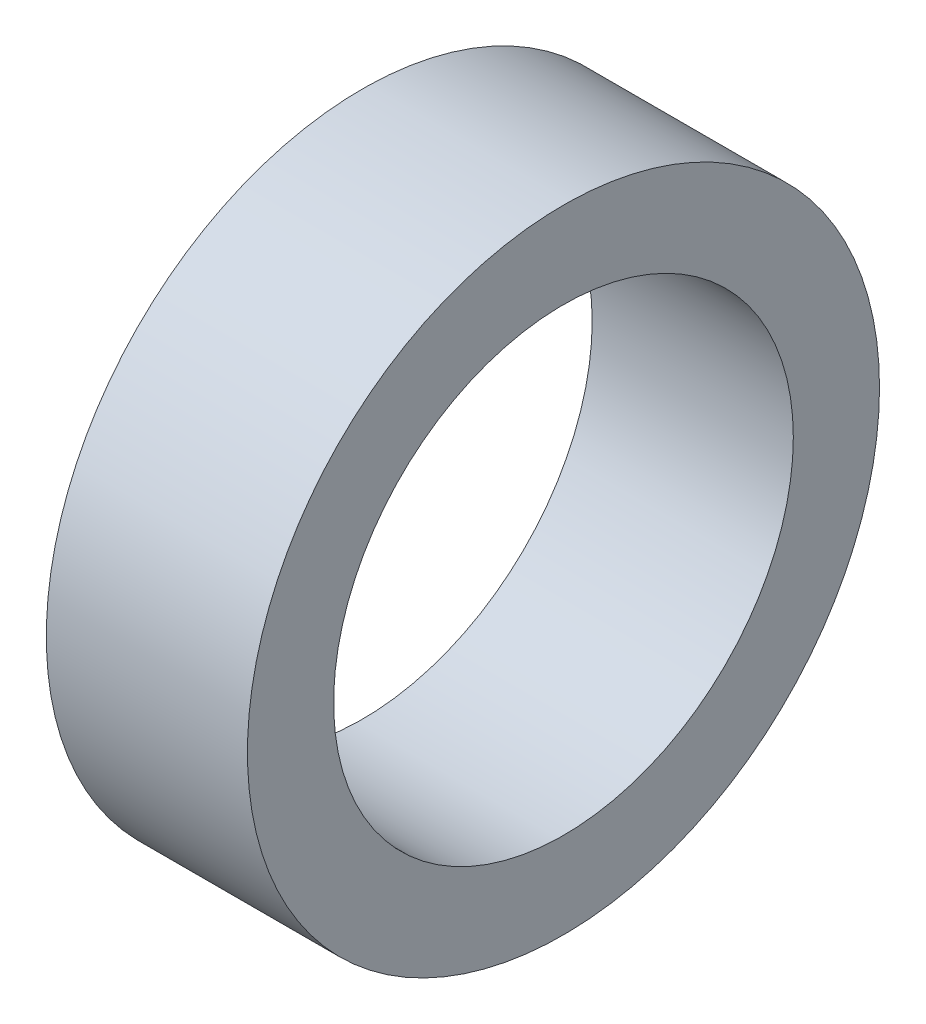
ISO-10303-21;
HEADER;
FILE_DESCRIPTION(('STEP AP214'),'2;1');
FILE_NAME('part.step','',(''),(''),'','','');
FILE_SCHEMA(('AUTOMOTIVE_DESIGN { 1 0 10303 214 1 1 1 1 }'));
ENDSEC;
DATA;
#1=APPLICATION_CONTEXT('core data for automotive mechanical design processes');
#2=APPLICATION_PROTOCOL_DEFINITION('international standard','automotive_design',2000,#1);
#3=PRODUCT_CONTEXT('',#1,'mechanical');
#4=PRODUCT('Part','Part','',(#3));
#5=PRODUCT_RELATED_PRODUCT_CATEGORY('part','',(#4));
#6=PRODUCT_DEFINITION_FORMATION('','',#4);
#7=PRODUCT_DEFINITION_CONTEXT('part definition',#1,'design');
#8=PRODUCT_DEFINITION('design','',#6,#7);
#9=PRODUCT_DEFINITION_SHAPE('','',#8);
#10=(LENGTH_UNIT() NAMED_UNIT(*) SI_UNIT(.MILLI.,.METRE.));
#11=(NAMED_UNIT(*) PLANE_ANGLE_UNIT() SI_UNIT($,.RADIAN.));
#12=(NAMED_UNIT(*) SI_UNIT($,.STERADIAN.) SOLID_ANGLE_UNIT());
#13=UNCERTAINTY_MEASURE_WITH_UNIT(LENGTH_MEASURE(1.E-05),#10,'distance_accuracy_value','');
#14=(GEOMETRIC_REPRESENTATION_CONTEXT(3) GLOBAL_UNCERTAINTY_ASSIGNED_CONTEXT((#13)) GLOBAL_UNIT_ASSIGNED_CONTEXT((#10,
#11,#12)) REPRESENTATION_CONTEXT('',''));
#15=CARTESIAN_POINT('',(0.,0.,0.));
#16=DIRECTION('',(0.,0.,1.));
#17=DIRECTION('',(1.,0.,0.));
#18=AXIS2_PLACEMENT_3D('',#15,#16,#17);
#19=CARTESIAN_POINT('',(17.5,0.,0.));
#20=DIRECTION('',(1.,0.,0.));
#21=DIRECTION('',(0.,0.,-1.));
#22=AXIS2_PLACEMENT_3D('',#19,#20,#21);
#23=PLANE('',#22);
#24=CARTESIAN_POINT('',(17.5,0.,0.));
#25=DIRECTION('',(1.,0.,0.));
#26=DIRECTION('',(0.,0.,-1.));
#27=AXIS2_PLACEMENT_3D('',#24,#25,#26);
#28=CIRCLE('',#27,27.5);
#29=CARTESIAN_POINT('',(17.5,0.,-27.5));
#30=VERTEX_POINT('',#29);
#31=EDGE_CURVE('E10',#30,#30,#28,.T.);
#32=ORIENTED_EDGE('',*,*,#31,.T.);
#33=EDGE_LOOP('',(#32));
#34=FACE_BOUND('',#33,.T.);
#35=CARTESIAN_POINT('',(17.5,0.,0.));
#36=DIRECTION('',(1.,0.,0.));
#37=DIRECTION('',(0.,0.,-1.));
#38=AXIS2_PLACEMENT_3D('',#35,#36,#37);
#39=CIRCLE('',#38,20.);
#40=CARTESIAN_POINT('',(17.5,0.,-20.));
#41=VERTEX_POINT('',#40);
#42=EDGE_CURVE('E50',#41,#41,#39,.T.);
#43=ORIENTED_EDGE('',*,*,#42,.F.);
#44=EDGE_LOOP('',(#43));
#45=FACE_BOUND('',#44,.T.);
#46=ADVANCED_FACE('F39',(#34,#45),#23,.T.);
#47=CARTESIAN_POINT('',(0.,0.,0.));
#48=DIRECTION('',(1.,0.,0.));
#49=DIRECTION('',(0.,0.,-1.));
#50=AXIS2_PLACEMENT_3D('',#47,#48,#49);
#51=PLANE('',#50);
#52=CARTESIAN_POINT('',(0.,0.,0.));
#53=DIRECTION('',(1.,0.,0.));
#54=DIRECTION('',(0.,0.,-1.));
#55=AXIS2_PLACEMENT_3D('',#52,#53,#54);
#56=CIRCLE('',#55,27.5);
#57=CARTESIAN_POINT('',(0.,0.,-27.5));
#58=VERTEX_POINT('',#57);
#59=EDGE_CURVE('E43',#58,#58,#56,.T.);
#60=ORIENTED_EDGE('',*,*,#59,.F.);
#61=EDGE_LOOP('',(#60));
#62=FACE_BOUND('',#61,.T.);
#63=CARTESIAN_POINT('',(0.,0.,0.));
#64=DIRECTION('',(1.,0.,0.));
#65=DIRECTION('',(0.,0.,-1.));
#66=AXIS2_PLACEMENT_3D('',#63,#64,#65);
#67=CIRCLE('',#66,20.);
#68=CARTESIAN_POINT('',(0.,0.,-20.));
#69=VERTEX_POINT('',#68);
#70=EDGE_CURVE('E52',#69,#69,#67,.T.);
#71=ORIENTED_EDGE('',*,*,#70,.T.);
#72=EDGE_LOOP('',(#71));
#73=FACE_BOUND('',#72,.T.);
#74=ADVANCED_FACE('F62',(#62,#73),#51,.F.);
#75=CARTESIAN_POINT('',(17.5,0.,0.));
#76=DIRECTION('',(-1.,0.,0.));
#77=DIRECTION('',(0.,0.,1.));
#78=AXIS2_PLACEMENT_3D('',#75,#76,#77);
#79=CYLINDRICAL_SURFACE('',#78,27.5);
#80=ORIENTED_EDGE('',*,*,#31,.F.);
#81=EDGE_LOOP('',(#80));
#82=FACE_BOUND('',#81,.T.);
#83=ORIENTED_EDGE('',*,*,#59,.T.);
#84=EDGE_LOOP('',(#83));
#85=FACE_BOUND('',#84,.T.);
#86=ADVANCED_FACE('F41',(#82,#85),#79,.T.);
#87=CARTESIAN_POINT('',(17.5,0.,0.));
#88=DIRECTION('',(-1.,0.,0.));
#89=DIRECTION('',(0.,0.,1.));
#90=AXIS2_PLACEMENT_3D('',#87,#88,#89);
#91=CYLINDRICAL_SURFACE('',#90,20.);
#92=ORIENTED_EDGE('',*,*,#42,.T.);
#93=EDGE_LOOP('',(#92));
#94=FACE_BOUND('',#93,.T.);
#95=ORIENTED_EDGE('',*,*,#70,.F.);
#96=EDGE_LOOP('',(#95));
#97=FACE_BOUND('',#96,.T.);
#98=ADVANCED_FACE('F58',(#94,#97),#91,.F.);
#99=CLOSED_SHELL('',(#46,#74,#86,#98));
#100=MANIFOLD_SOLID_BREP('B2',#99);
#101=ADVANCED_BREP_SHAPE_REPRESENTATION('',(#18,#100),#14);
#102=SHAPE_DEFINITION_REPRESENTATION(#9,#101);
ENDSEC;
END-ISO-10303-21;
